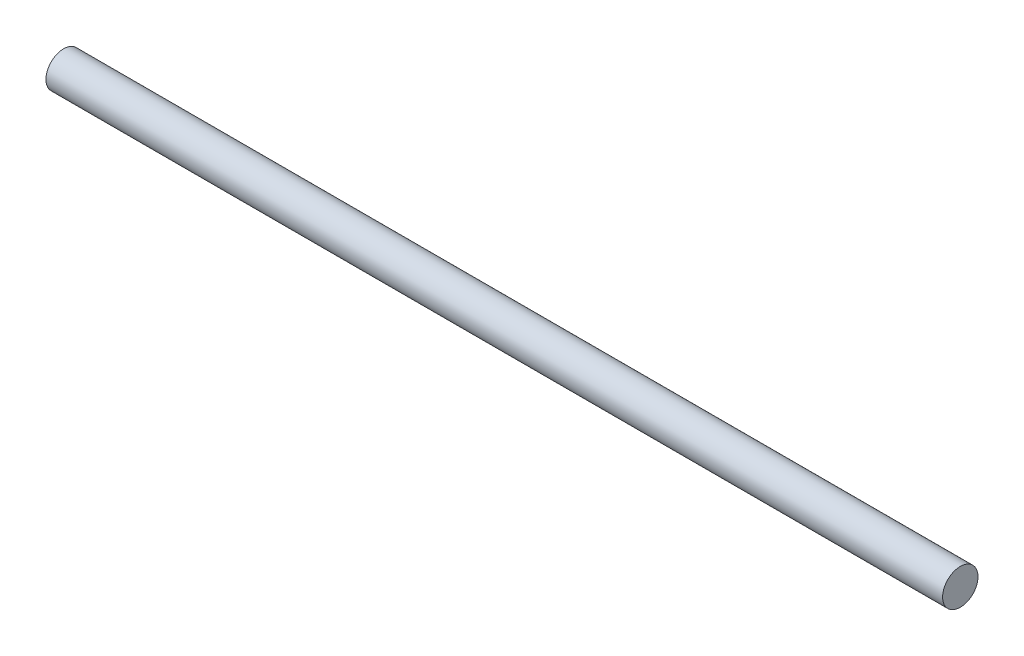
ISO-10303-21;
HEADER;
FILE_DESCRIPTION(('STEP AP214'),'2;1');
FILE_NAME('part.step','',(''),(''),'','','');
FILE_SCHEMA(('AUTOMOTIVE_DESIGN { 1 0 10303 214 1 1 1 1 }'));
ENDSEC;
DATA;
#1=APPLICATION_CONTEXT('core data for automotive mechanical design processes');
#2=APPLICATION_PROTOCOL_DEFINITION('international standard','automotive_design',2000,#1);
#3=PRODUCT_CONTEXT('',#1,'mechanical');
#4=PRODUCT('Part','Part','',(#3));
#5=PRODUCT_RELATED_PRODUCT_CATEGORY('part','',(#4));
#6=PRODUCT_DEFINITION_FORMATION('','',#4);
#7=PRODUCT_DEFINITION_CONTEXT('part definition',#1,'design');
#8=PRODUCT_DEFINITION('design','',#6,#7);
#9=PRODUCT_DEFINITION_SHAPE('','',#8);
#10=(LENGTH_UNIT() NAMED_UNIT(*) SI_UNIT(.MILLI.,.METRE.));
#11=(NAMED_UNIT(*) PLANE_ANGLE_UNIT() SI_UNIT($,.RADIAN.));
#12=(NAMED_UNIT(*) SI_UNIT($,.STERADIAN.) SOLID_ANGLE_UNIT());
#13=UNCERTAINTY_MEASURE_WITH_UNIT(LENGTH_MEASURE(1.E-05),#10,'distance_accuracy_value','');
#14=(GEOMETRIC_REPRESENTATION_CONTEXT(3) GLOBAL_UNCERTAINTY_ASSIGNED_CONTEXT((#13)) GLOBAL_UNIT_ASSIGNED_CONTEXT((#10,
#11,#12)) REPRESENTATION_CONTEXT('',''));
#15=CARTESIAN_POINT('',(0.,0.,0.));
#16=DIRECTION('',(0.,0.,1.));
#17=DIRECTION('',(1.,0.,0.));
#18=AXIS2_PLACEMENT_3D('',#15,#16,#17);
#19=CARTESIAN_POINT('',(59.5,0.,0.));
#20=DIRECTION('',(-1.,0.,0.));
#21=DIRECTION('',(0.,0.,1.));
#22=AXIS2_PLACEMENT_3D('',#19,#20,#21);
#23=CYLINDRICAL_SURFACE('',#22,2.35);
#24=CARTESIAN_POINT('',(59.5,0.,0.));
#25=DIRECTION('',(1.,0.,0.));
#26=DIRECTION('',(0.,0.,-1.));
#27=AXIS2_PLACEMENT_3D('',#24,#25,#26);
#28=CIRCLE('',#27,2.35);
#29=CARTESIAN_POINT('',(59.5,0.,-2.35));
#30=VERTEX_POINT('',#29);
#31=EDGE_CURVE('E10',#30,#30,#28,.T.);
#32=ORIENTED_EDGE('',*,*,#31,.F.);
#33=EDGE_LOOP('',(#32));
#34=FACE_BOUND('',#33,.T.);
#35=CARTESIAN_POINT('',(-59.5,0.,0.));
#36=DIRECTION('',(1.,0.,0.));
#37=DIRECTION('',(0.,0.,-1.));
#38=AXIS2_PLACEMENT_3D('',#35,#36,#37);
#39=CIRCLE('',#38,2.35);
#40=CARTESIAN_POINT('',(-59.5,0.,-2.35));
#41=VERTEX_POINT('',#40);
#42=EDGE_CURVE('E40',#41,#41,#39,.T.);
#43=ORIENTED_EDGE('',*,*,#42,.T.);
#44=EDGE_LOOP('',(#43));
#45=FACE_BOUND('',#44,.T.);
#46=ADVANCED_FACE('F37',(#34,#45),#23,.T.);
#47=CARTESIAN_POINT('',(59.5,0.,0.));
#48=DIRECTION('',(1.,0.,0.));
#49=DIRECTION('',(0.,0.,-1.));
#50=AXIS2_PLACEMENT_3D('',#47,#48,#49);
#51=PLANE('',#50);
#52=ORIENTED_EDGE('',*,*,#31,.T.);
#53=EDGE_LOOP('',(#52));
#54=FACE_BOUND('',#53,.T.);
#55=ADVANCED_FACE('F52',(#54),#51,.T.);
#56=CARTESIAN_POINT('',(-59.5,0.,0.));
#57=DIRECTION('',(1.,0.,0.));
#58=DIRECTION('',(0.,0.,-1.));
#59=AXIS2_PLACEMENT_3D('',#56,#57,#58);
#60=PLANE('',#59);
#61=ORIENTED_EDGE('',*,*,#42,.F.);
#62=EDGE_LOOP('',(#61));
#63=FACE_BOUND('',#62,.T.);
#64=ADVANCED_FACE('F50',(#63),#60,.F.);
#65=CLOSED_SHELL('',(#46,#55,#64));
#66=MANIFOLD_SOLID_BREP('B2',#65);
#67=ADVANCED_BREP_SHAPE_REPRESENTATION('',(#18,#66),#14);
#68=SHAPE_DEFINITION_REPRESENTATION(#9,#67);
ENDSEC;
END-ISO-10303-21;
